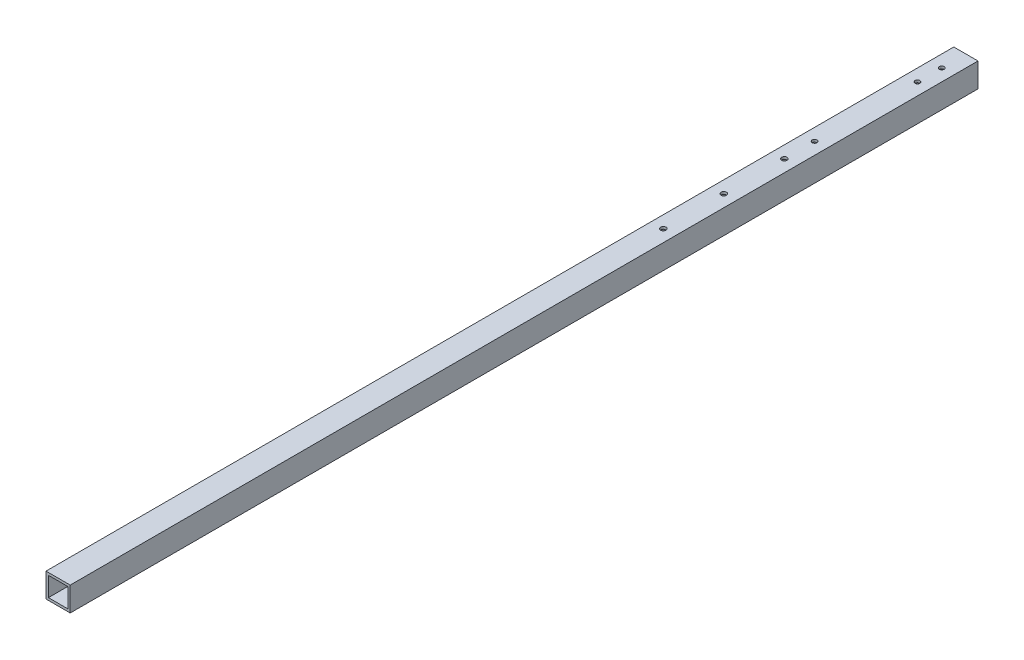
ISO-10303-21;
HEADER;
FILE_DESCRIPTION(('STEP AP214'),'2;1');
FILE_NAME('part.step','',(''),(''),'','','');
FILE_SCHEMA(('AUTOMOTIVE_DESIGN { 1 0 10303 214 1 1 1 1 }'));
ENDSEC;
DATA;
#1=APPLICATION_CONTEXT('core data for automotive mechanical design processes');
#2=APPLICATION_PROTOCOL_DEFINITION('international standard','automotive_design',2000,#1);
#3=PRODUCT_CONTEXT('',#1,'mechanical');
#4=PRODUCT('Part','Part','',(#3));
#5=PRODUCT_RELATED_PRODUCT_CATEGORY('part','',(#4));
#6=PRODUCT_DEFINITION_FORMATION('','',#4);
#7=PRODUCT_DEFINITION_CONTEXT('part definition',#1,'design');
#8=PRODUCT_DEFINITION('design','',#6,#7);
#9=PRODUCT_DEFINITION_SHAPE('','',#8);
#10=(LENGTH_UNIT() NAMED_UNIT(*) SI_UNIT(.MILLI.,.METRE.));
#11=(NAMED_UNIT(*) PLANE_ANGLE_UNIT() SI_UNIT($,.RADIAN.));
#12=(NAMED_UNIT(*) SI_UNIT($,.STERADIAN.) SOLID_ANGLE_UNIT());
#13=UNCERTAINTY_MEASURE_WITH_UNIT(LENGTH_MEASURE(1.E-05),#10,'distance_accuracy_value','');
#14=(GEOMETRIC_REPRESENTATION_CONTEXT(3) GLOBAL_UNCERTAINTY_ASSIGNED_CONTEXT((#13)) GLOBAL_UNIT_ASSIGNED_CONTEXT((#10,
#11,#12)) REPRESENTATION_CONTEXT('',''));
#15=CARTESIAN_POINT('',(0.,0.,0.));
#16=DIRECTION('',(0.,0.,1.));
#17=DIRECTION('',(1.,0.,0.));
#18=AXIS2_PLACEMENT_3D('',#15,#16,#17);
#19=CARTESIAN_POINT('',(0.,0.,375.));
#20=DIRECTION('',(0.,0.,1.));
#21=DIRECTION('',(1.,0.,0.));
#22=AXIS2_PLACEMENT_3D('',#19,#20,#21);
#23=PLANE('',#22);
#24=DIRECTION('',(0.,1.,0.));
#25=VECTOR('',#24,1.);
#26=CARTESIAN_POINT('',(10.,10.,375.));
#27=LINE('',#26,#25);
#28=CARTESIAN_POINT('',(10.,-10.,375.));
#29=VERTEX_POINT('',#28);
#30=CARTESIAN_POINT('',(10.,10.,375.));
#31=VERTEX_POINT('',#30);
#32=EDGE_CURVE('E142',#29,#31,#27,.T.);
#33=ORIENTED_EDGE('',*,*,#32,.T.);
#34=DIRECTION('',(-1.,0.,0.));
#35=VECTOR('',#34,1.);
#36=CARTESIAN_POINT('',(-10.,10.,375.));
#37=LINE('',#36,#35);
#38=CARTESIAN_POINT('',(-10.,10.,375.));
#39=VERTEX_POINT('',#38);
#40=EDGE_CURVE('E145',#31,#39,#37,.T.);
#41=ORIENTED_EDGE('',*,*,#40,.T.);
#42=DIRECTION('',(0.,-1.,0.));
#43=VECTOR('',#42,1.);
#44=CARTESIAN_POINT('',(-10.,10.,375.));
#45=LINE('',#44,#43);
#46=CARTESIAN_POINT('',(-10.,-10.,375.));
#47=VERTEX_POINT('',#46);
#48=EDGE_CURVE('E148',#39,#47,#45,.T.);
#49=ORIENTED_EDGE('',*,*,#48,.T.);
#50=DIRECTION('',(1.,0.,0.));
#51=VECTOR('',#50,1.);
#52=CARTESIAN_POINT('',(-10.,-10.,375.));
#53=LINE('',#52,#51);
#54=EDGE_CURVE('E150',#47,#29,#53,.T.);
#55=ORIENTED_EDGE('',*,*,#54,.T.);
#56=EDGE_LOOP('',(#33,#41,#49,#55));
#57=FACE_BOUND('',#56,.T.);
#58=DIRECTION('',(-1.,0.,0.));
#59=VECTOR('',#58,1.);
#60=CARTESIAN_POINT('',(-8.,8.00000000000001,375.));
#61=LINE('',#60,#59);
#62=CARTESIAN_POINT('',(8.,8.00000000000001,375.));
#63=VERTEX_POINT('',#62);
#64=CARTESIAN_POINT('',(-8.,8.00000000000001,375.));
#65=VERTEX_POINT('',#64);
#66=EDGE_CURVE('E112',#63,#65,#61,.T.);
#67=ORIENTED_EDGE('',*,*,#66,.F.);
#68=DIRECTION('',(0.,1.,0.));
#69=VECTOR('',#68,1.);
#70=CARTESIAN_POINT('',(8.,8.00000000000001,375.));
#71=LINE('',#70,#69);
#72=CARTESIAN_POINT('',(8.,-7.99999999999999,375.));
#73=VERTEX_POINT('',#72);
#74=EDGE_CURVE('E104',#73,#63,#71,.T.);
#75=ORIENTED_EDGE('',*,*,#74,.F.);
#76=DIRECTION('',(1.,0.,0.));
#77=VECTOR('',#76,1.);
#78=CARTESIAN_POINT('',(-8.,-7.99999999999999,375.));
#79=LINE('',#78,#77);
#80=CARTESIAN_POINT('',(-8.,-7.99999999999999,375.));
#81=VERTEX_POINT('',#80);
#82=EDGE_CURVE('E126',#81,#73,#79,.T.);
#83=ORIENTED_EDGE('',*,*,#82,.F.);
#84=DIRECTION('',(0.,-1.,0.));
#85=VECTOR('',#84,1.);
#86=CARTESIAN_POINT('',(-8.,8.00000000000001,375.));
#87=LINE('',#86,#85);
#88=EDGE_CURVE('E124',#65,#81,#87,.T.);
#89=ORIENTED_EDGE('',*,*,#88,.F.);
#90=EDGE_LOOP('',(#67,#75,#83,#89));
#91=FACE_BOUND('',#90,.T.);
#92=ADVANCED_FACE('F37',(#57,#91),#23,.T.);
#93=CARTESIAN_POINT('',(0.,0.,-375.));
#94=DIRECTION('',(0.,0.,1.));
#95=DIRECTION('',(1.,0.,0.));
#96=AXIS2_PLACEMENT_3D('',#93,#94,#95);
#97=PLANE('',#96);
#98=DIRECTION('',(0.,1.,0.));
#99=VECTOR('',#98,1.);
#100=CARTESIAN_POINT('',(10.,10.,-375.));
#101=LINE('',#100,#99);
#102=CARTESIAN_POINT('',(10.,-10.,-375.));
#103=VERTEX_POINT('',#102);
#104=CARTESIAN_POINT('',(10.,10.,-375.));
#105=VERTEX_POINT('',#104);
#106=EDGE_CURVE('E120',#103,#105,#101,.T.);
#107=ORIENTED_EDGE('',*,*,#106,.F.);
#108=DIRECTION('',(1.,0.,0.));
#109=VECTOR('',#108,1.);
#110=CARTESIAN_POINT('',(-10.,-10.,-375.));
#111=LINE('',#110,#109);
#112=CARTESIAN_POINT('',(-10.,-10.,-375.));
#113=VERTEX_POINT('',#112);
#114=EDGE_CURVE('E146',#113,#103,#111,.T.);
#115=ORIENTED_EDGE('',*,*,#114,.F.);
#116=DIRECTION('',(0.,-1.,0.));
#117=VECTOR('',#116,1.);
#118=CARTESIAN_POINT('',(-10.,10.,-375.));
#119=LINE('',#118,#117);
#120=CARTESIAN_POINT('',(-10.,10.,-375.));
#121=VERTEX_POINT('',#120);
#122=EDGE_CURVE('E157',#121,#113,#119,.T.);
#123=ORIENTED_EDGE('',*,*,#122,.F.);
#124=DIRECTION('',(-1.,0.,0.));
#125=VECTOR('',#124,1.);
#126=CARTESIAN_POINT('',(-10.,10.,-375.));
#127=LINE('',#126,#125);
#128=EDGE_CURVE('E155',#105,#121,#127,.T.);
#129=ORIENTED_EDGE('',*,*,#128,.F.);
#130=EDGE_LOOP('',(#107,#115,#123,#129));
#131=FACE_BOUND('',#130,.T.);
#132=DIRECTION('',(0.,1.,0.));
#133=VECTOR('',#132,1.);
#134=CARTESIAN_POINT('',(8.,8.00000000000001,-375.));
#135=LINE('',#134,#133);
#136=CARTESIAN_POINT('',(8.,-7.99999999999999,-375.));
#137=VERTEX_POINT('',#136);
#138=CARTESIAN_POINT('',(8.,8.00000000000001,-375.));
#139=VERTEX_POINT('',#138);
#140=EDGE_CURVE('E62',#137,#139,#135,.T.);
#141=ORIENTED_EDGE('',*,*,#140,.T.);
#142=DIRECTION('',(-1.,0.,0.));
#143=VECTOR('',#142,1.);
#144=CARTESIAN_POINT('',(-8.,8.00000000000001,-375.));
#145=LINE('',#144,#143);
#146=CARTESIAN_POINT('',(-8.,8.00000000000001,-375.));
#147=VERTEX_POINT('',#146);
#148=EDGE_CURVE('E119',#139,#147,#145,.T.);
#149=ORIENTED_EDGE('',*,*,#148,.T.);
#150=DIRECTION('',(0.,-1.,0.));
#151=VECTOR('',#150,1.);
#152=CARTESIAN_POINT('',(-8.,8.00000000000001,-375.));
#153=LINE('',#152,#151);
#154=CARTESIAN_POINT('',(-8.,-7.99999999999999,-375.));
#155=VERTEX_POINT('',#154);
#156=EDGE_CURVE('E134',#147,#155,#153,.T.);
#157=ORIENTED_EDGE('',*,*,#156,.T.);
#158=DIRECTION('',(1.,0.,0.));
#159=VECTOR('',#158,1.);
#160=CARTESIAN_POINT('',(-8.,-7.99999999999999,-375.));
#161=LINE('',#160,#159);
#162=EDGE_CURVE('E113',#155,#137,#161,.T.);
#163=ORIENTED_EDGE('',*,*,#162,.T.);
#164=EDGE_LOOP('',(#141,#149,#157,#163));
#165=FACE_BOUND('',#164,.T.);
#166=ADVANCED_FACE('F259',(#131,#165),#97,.F.);
#167=CARTESIAN_POINT('',(10.,10.,375.));
#168=DIRECTION('',(-1.,0.,0.));
#169=DIRECTION('',(0.,0.,1.));
#170=AXIS2_PLACEMENT_3D('',#167,#168,#169);
#171=PLANE('',#170);
#172=ORIENTED_EDGE('',*,*,#106,.T.);
#173=DIRECTION('',(0.,0.,-1.));
#174=VECTOR('',#173,1.);
#175=CARTESIAN_POINT('',(10.,10.,375.));
#176=LINE('',#175,#174);
#177=EDGE_CURVE('E11',#31,#105,#176,.T.);
#178=ORIENTED_EDGE('',*,*,#177,.F.);
#179=ORIENTED_EDGE('',*,*,#32,.F.);
#180=DIRECTION('',(0.,0.,-1.));
#181=VECTOR('',#180,1.);
#182=CARTESIAN_POINT('',(10.,-10.,375.));
#183=LINE('',#182,#181);
#184=EDGE_CURVE('E152',#29,#103,#183,.T.);
#185=ORIENTED_EDGE('',*,*,#184,.T.);
#186=EDGE_LOOP('',(#172,#178,#179,#185));
#187=FACE_BOUND('',#186,.T.);
#188=ADVANCED_FACE('F39',(#187),#171,.F.);
#189=CARTESIAN_POINT('',(-10.,10.,375.));
#190=DIRECTION('',(0.,-1.,0.));
#191=DIRECTION('',(1.,0.,0.));
#192=AXIS2_PLACEMENT_3D('',#189,#190,#191);
#193=PLANE('',#192);
#194=CARTESIAN_POINT('',(0.,10.,-125.000000000008));
#195=DIRECTION('',(0.,1.,0.));
#196=DIRECTION('',(-1.,0.,0.));
#197=AXIS2_PLACEMENT_3D('',#194,#195,#196);
#198=CIRCLE('',#197,2.25);
#199=CARTESIAN_POINT('',(-2.24999999999999,10.,-125.000000000008));
#200=VERTEX_POINT('',#199);
#201=EDGE_CURVE('E497',#200,#200,#198,.T.);
#202=ORIENTED_EDGE('',*,*,#201,.F.);
#203=EDGE_LOOP('',(#202));
#204=FACE_BOUND('',#203,.T.);
#205=CARTESIAN_POINT('',(0.,10.,-175.000000000008));
#206=DIRECTION('',(0.,1.,0.));
#207=DIRECTION('',(-1.,0.,0.));
#208=AXIS2_PLACEMENT_3D('',#205,#206,#207);
#209=CIRCLE('',#208,2.25);
#210=CARTESIAN_POINT('',(-2.24999999999999,10.,-175.000000000008));
#211=VERTEX_POINT('',#210);
#212=EDGE_CURVE('E498',#211,#211,#209,.T.);
#213=ORIENTED_EDGE('',*,*,#212,.F.);
#214=EDGE_LOOP('',(#213));
#215=FACE_BOUND('',#214,.T.);
#216=CARTESIAN_POINT('',(0.,10.,-225.000000000008));
#217=DIRECTION('',(0.,1.,0.));
#218=DIRECTION('',(-1.,0.,0.));
#219=AXIS2_PLACEMENT_3D('',#216,#217,#218);
#220=CIRCLE('',#219,2.24999999999952);
#221=CARTESIAN_POINT('',(-2.2499999999995,10.,-225.000000000008));
#222=VERTEX_POINT('',#221);
#223=EDGE_CURVE('E507',#222,#222,#220,.T.);
#224=ORIENTED_EDGE('',*,*,#223,.F.);
#225=EDGE_LOOP('',(#224));
#226=FACE_BOUND('',#225,.T.);
#227=CARTESIAN_POINT('',(0.,10.,-355.000000000003));
#228=DIRECTION('',(0.,1.,0.));
#229=DIRECTION('',(-1.,0.,0.));
#230=AXIS2_PLACEMENT_3D('',#227,#228,#229);
#231=CIRCLE('',#230,2.00000000000003);
#232=CARTESIAN_POINT('',(-2.00000000000006,10.,-355.000000000003));
#233=VERTEX_POINT('',#232);
#234=EDGE_CURVE('E171',#233,#233,#231,.T.);
#235=ORIENTED_EDGE('',*,*,#234,.F.);
#236=EDGE_LOOP('',(#235));
#237=FACE_BOUND('',#236,.T.);
#238=CARTESIAN_POINT('',(2.48932818802672E-13,10.,-335.000000000003));
#239=DIRECTION('',(0.,1.,0.));
#240=DIRECTION('',(-1.,0.,0.));
#241=AXIS2_PLACEMENT_3D('',#238,#239,#240);
#242=CIRCLE('',#241,2.);
#243=CARTESIAN_POINT('',(-1.99999999999975,10.,-335.000000000003));
#244=VERTEX_POINT('',#243);
#245=EDGE_CURVE('E207',#244,#244,#242,.T.);
#246=ORIENTED_EDGE('',*,*,#245,.F.);
#247=EDGE_LOOP('',(#246));
#248=FACE_BOUND('',#247,.T.);
#249=CARTESIAN_POINT('',(0.,10.,-250.000000000002));
#250=DIRECTION('',(0.,1.,0.));
#251=DIRECTION('',(-1.,0.,0.));
#252=AXIS2_PLACEMENT_3D('',#249,#250,#251);
#253=CIRCLE('',#252,2.00000000000003);
#254=CARTESIAN_POINT('',(-2.00000000000003,10.,-250.000000000002));
#255=VERTEX_POINT('',#254);
#256=EDGE_CURVE('E213',#255,#255,#253,.T.);
#257=ORIENTED_EDGE('',*,*,#256,.F.);
#258=EDGE_LOOP('',(#257));
#259=FACE_BOUND('',#258,.T.);
#260=ORIENTED_EDGE('',*,*,#128,.T.);
#261=DIRECTION('',(0.,0.,-1.));
#262=VECTOR('',#261,1.);
#263=CARTESIAN_POINT('',(-10.,10.,375.));
#264=LINE('',#263,#262);
#265=EDGE_CURVE('E46',#39,#121,#264,.T.);
#266=ORIENTED_EDGE('',*,*,#265,.F.);
#267=ORIENTED_EDGE('',*,*,#40,.F.);
#268=ORIENTED_EDGE('',*,*,#177,.T.);
#269=EDGE_LOOP('',(#260,#266,#267,#268));
#270=FACE_BOUND('',#269,.T.);
#271=ADVANCED_FACE('F245',(#204,#215,#226,#237,#248,#259,#270),#193,.F.);
#272=CARTESIAN_POINT('',(-10.,10.,375.));
#273=DIRECTION('',(1.,0.,0.));
#274=DIRECTION('',(0.,1.,0.));
#275=AXIS2_PLACEMENT_3D('',#272,#273,#274);
#276=PLANE('',#275);
#277=ORIENTED_EDGE('',*,*,#122,.T.);
#278=DIRECTION('',(0.,0.,-1.));
#279=VECTOR('',#278,1.);
#280=CARTESIAN_POINT('',(-10.,-10.,375.));
#281=LINE('',#280,#279);
#282=EDGE_CURVE('E162',#47,#113,#281,.T.);
#283=ORIENTED_EDGE('',*,*,#282,.F.);
#284=ORIENTED_EDGE('',*,*,#48,.F.);
#285=ORIENTED_EDGE('',*,*,#265,.T.);
#286=EDGE_LOOP('',(#277,#283,#284,#285));
#287=FACE_BOUND('',#286,.T.);
#288=ADVANCED_FACE('F248',(#287),#276,.F.);
#289=CARTESIAN_POINT('',(-10.,-10.,375.));
#290=DIRECTION('',(0.,1.,0.));
#291=DIRECTION('',(-1.,0.,0.));
#292=AXIS2_PLACEMENT_3D('',#289,#290,#291);
#293=PLANE('',#292);
#294=CARTESIAN_POINT('',(0.,-10.,-125.000000000008));
#295=DIRECTION('',(0.,1.,0.));
#296=DIRECTION('',(-1.,0.,0.));
#297=AXIS2_PLACEMENT_3D('',#294,#295,#296);
#298=CIRCLE('',#297,2.25);
#299=CARTESIAN_POINT('',(-2.24999999999999,-10.,-125.000000000008));
#300=VERTEX_POINT('',#299);
#301=EDGE_CURVE('E182',#300,#300,#298,.T.);
#302=ORIENTED_EDGE('',*,*,#301,.T.);
#303=EDGE_LOOP('',(#302));
#304=FACE_BOUND('',#303,.T.);
#305=CARTESIAN_POINT('',(0.,-10.,-175.000000000008));
#306=DIRECTION('',(0.,1.,0.));
#307=DIRECTION('',(-1.,0.,0.));
#308=AXIS2_PLACEMENT_3D('',#305,#306,#307);
#309=CIRCLE('',#308,2.25);
#310=CARTESIAN_POINT('',(-2.24999999999999,-10.,-175.000000000008));
#311=VERTEX_POINT('',#310);
#312=EDGE_CURVE('E503',#311,#311,#309,.T.);
#313=ORIENTED_EDGE('',*,*,#312,.T.);
#314=EDGE_LOOP('',(#313));
#315=FACE_BOUND('',#314,.T.);
#316=CARTESIAN_POINT('',(0.,-10.,-225.000000000008));
#317=DIRECTION('',(0.,1.,0.));
#318=DIRECTION('',(-1.,0.,0.));
#319=AXIS2_PLACEMENT_3D('',#316,#317,#318);
#320=CIRCLE('',#319,2.24999999999952);
#321=CARTESIAN_POINT('',(-2.2499999999995,-10.,-225.000000000008));
#322=VERTEX_POINT('',#321);
#323=EDGE_CURVE('E195',#322,#322,#320,.T.);
#324=ORIENTED_EDGE('',*,*,#323,.T.);
#325=EDGE_LOOP('',(#324));
#326=FACE_BOUND('',#325,.T.);
#327=CARTESIAN_POINT('',(0.,-10.,-355.000000000003));
#328=DIRECTION('',(0.,1.,0.));
#329=DIRECTION('',(-1.,0.,0.));
#330=AXIS2_PLACEMENT_3D('',#327,#328,#329);
#331=CIRCLE('',#330,2.00000000000003);
#332=CARTESIAN_POINT('',(-2.00000000000006,-10.,-355.000000000003));
#333=VERTEX_POINT('',#332);
#334=EDGE_CURVE('E204',#333,#333,#331,.T.);
#335=ORIENTED_EDGE('',*,*,#334,.T.);
#336=EDGE_LOOP('',(#335));
#337=FACE_BOUND('',#336,.T.);
#338=CARTESIAN_POINT('',(2.47198095326695E-13,-10.,-335.000000000003));
#339=DIRECTION('',(0.,1.,0.));
#340=DIRECTION('',(-1.,0.,0.));
#341=AXIS2_PLACEMENT_3D('',#338,#339,#340);
#342=CIRCLE('',#341,2.);
#343=CARTESIAN_POINT('',(-1.99999999999975,-10.,-335.000000000003));
#344=VERTEX_POINT('',#343);
#345=EDGE_CURVE('E210',#344,#344,#342,.T.);
#346=ORIENTED_EDGE('',*,*,#345,.T.);
#347=EDGE_LOOP('',(#346));
#348=FACE_BOUND('',#347,.T.);
#349=CARTESIAN_POINT('',(0.,-10.,-250.000000000002));
#350=DIRECTION('',(0.,1.,0.));
#351=DIRECTION('',(-1.,0.,0.));
#352=AXIS2_PLACEMENT_3D('',#349,#350,#351);
#353=CIRCLE('',#352,2.00000000000003);
#354=CARTESIAN_POINT('',(-2.00000000000004,-10.,-250.000000000002));
#355=VERTEX_POINT('',#354);
#356=EDGE_CURVE('E201',#355,#355,#353,.T.);
#357=ORIENTED_EDGE('',*,*,#356,.T.);
#358=EDGE_LOOP('',(#357));
#359=FACE_BOUND('',#358,.T.);
#360=ORIENTED_EDGE('',*,*,#114,.T.);
#361=ORIENTED_EDGE('',*,*,#184,.F.);
#362=ORIENTED_EDGE('',*,*,#54,.F.);
#363=ORIENTED_EDGE('',*,*,#282,.T.);
#364=EDGE_LOOP('',(#360,#361,#362,#363));
#365=FACE_BOUND('',#364,.T.);
#366=ADVANCED_FACE('F263',(#304,#315,#326,#337,#348,#359,#365),#293,.F.);
#367=CARTESIAN_POINT('',(8.,8.00000000000001,375.));
#368=DIRECTION('',(-1.,0.,0.));
#369=DIRECTION('',(0.,-1.,0.));
#370=AXIS2_PLACEMENT_3D('',#367,#368,#369);
#371=PLANE('',#370);
#372=ORIENTED_EDGE('',*,*,#140,.F.);
#373=DIRECTION('',(0.,0.,-1.));
#374=VECTOR('',#373,1.);
#375=CARTESIAN_POINT('',(8.,-7.99999999999999,375.));
#376=LINE('',#375,#374);
#377=EDGE_CURVE('E108',#73,#137,#376,.T.);
#378=ORIENTED_EDGE('',*,*,#377,.F.);
#379=ORIENTED_EDGE('',*,*,#74,.T.);
#380=DIRECTION('',(0.,0.,-1.));
#381=VECTOR('',#380,1.);
#382=CARTESIAN_POINT('',(8.,8.00000000000001,375.));
#383=LINE('',#382,#381);
#384=EDGE_CURVE('E107',#63,#139,#383,.T.);
#385=ORIENTED_EDGE('',*,*,#384,.T.);
#386=EDGE_LOOP('',(#372,#378,#379,#385));
#387=FACE_BOUND('',#386,.T.);
#388=ADVANCED_FACE('F106',(#387),#371,.T.);
#389=CARTESIAN_POINT('',(-8.,8.00000000000001,375.));
#390=DIRECTION('',(0.,-1.,0.));
#391=DIRECTION('',(1.,0.,0.));
#392=AXIS2_PLACEMENT_3D('',#389,#390,#391);
#393=PLANE('',#392);
#394=CARTESIAN_POINT('',(0.,8.00000000000001,-125.000000000008));
#395=DIRECTION('',(0.,-1.,0.));
#396=DIRECTION('',(1.,0.,0.));
#397=AXIS2_PLACEMENT_3D('',#394,#395,#396);
#398=CIRCLE('',#397,2.25);
#399=CARTESIAN_POINT('',(2.25000000000002,8.00000000000001,-125.000000000008));
#400=VERTEX_POINT('',#399);
#401=EDGE_CURVE('E198',#400,#400,#398,.T.);
#402=ORIENTED_EDGE('',*,*,#401,.F.);
#403=EDGE_LOOP('',(#402));
#404=FACE_BOUND('',#403,.T.);
#405=CARTESIAN_POINT('',(0.,8.00000000000001,-175.000000000008));
#406=DIRECTION('',(0.,-1.,0.));
#407=DIRECTION('',(1.,0.,0.));
#408=AXIS2_PLACEMENT_3D('',#405,#406,#407);
#409=CIRCLE('',#408,2.25);
#410=CARTESIAN_POINT('',(2.25000000000002,8.00000000000001,-175.000000000008));
#411=VERTEX_POINT('',#410);
#412=EDGE_CURVE('E185',#411,#411,#409,.T.);
#413=ORIENTED_EDGE('',*,*,#412,.F.);
#414=EDGE_LOOP('',(#413));
#415=FACE_BOUND('',#414,.T.);
#416=CARTESIAN_POINT('',(0.,8.00000000000001,-225.000000000008));
#417=DIRECTION('',(0.,-1.,0.));
#418=DIRECTION('',(1.,0.,0.));
#419=AXIS2_PLACEMENT_3D('',#416,#417,#418);
#420=CIRCLE('',#419,2.24999999999952);
#421=CARTESIAN_POINT('',(2.24999999999953,8.00000000000001,-225.000000000008));
#422=VERTEX_POINT('',#421);
#423=EDGE_CURVE('E181',#422,#422,#420,.T.);
#424=ORIENTED_EDGE('',*,*,#423,.F.);
#425=EDGE_LOOP('',(#424));
#426=FACE_BOUND('',#425,.T.);
#427=CARTESIAN_POINT('',(0.,8.00000000000001,-355.000000000003));
#428=DIRECTION('',(0.,-1.,0.));
#429=DIRECTION('',(1.,0.,0.));
#430=AXIS2_PLACEMENT_3D('',#427,#428,#429);
#431=CIRCLE('',#430,2.00000000000003);
#432=CARTESIAN_POINT('',(2.00000000000001,8.00000000000001,-355.000000000003));
#433=VERTEX_POINT('',#432);
#434=EDGE_CURVE('E132',#433,#433,#431,.T.);
#435=ORIENTED_EDGE('',*,*,#434,.F.);
#436=EDGE_LOOP('',(#435));
#437=FACE_BOUND('',#436,.T.);
#438=CARTESIAN_POINT('',(2.48759346455074E-13,8.00000000000001,-335.000000000003));
#439=DIRECTION('',(0.,-1.,0.));
#440=DIRECTION('',(1.,0.,0.));
#441=AXIS2_PLACEMENT_3D('',#438,#439,#440);
#442=CIRCLE('',#441,2.);
#443=CARTESIAN_POINT('',(2.00000000000025,8.00000000000001,-335.000000000003));
#444=VERTEX_POINT('',#443);
#445=EDGE_CURVE('E175',#444,#444,#442,.T.);
#446=ORIENTED_EDGE('',*,*,#445,.F.);
#447=EDGE_LOOP('',(#446));
#448=FACE_BOUND('',#447,.T.);
#449=CARTESIAN_POINT('',(0.,8.00000000000001,-250.000000000002));
#450=DIRECTION('',(0.,-1.,0.));
#451=DIRECTION('',(1.,0.,0.));
#452=AXIS2_PLACEMENT_3D('',#449,#450,#451);
#453=CIRCLE('',#452,2.00000000000003);
#454=CARTESIAN_POINT('',(2.00000000000004,8.00000000000001,-250.000000000002));
#455=VERTEX_POINT('',#454);
#456=EDGE_CURVE('E170',#455,#455,#453,.T.);
#457=ORIENTED_EDGE('',*,*,#456,.F.);
#458=EDGE_LOOP('',(#457));
#459=FACE_BOUND('',#458,.T.);
#460=ORIENTED_EDGE('',*,*,#148,.F.);
#461=ORIENTED_EDGE('',*,*,#384,.F.);
#462=ORIENTED_EDGE('',*,*,#66,.T.);
#463=DIRECTION('',(0.,0.,-1.));
#464=VECTOR('',#463,1.);
#465=CARTESIAN_POINT('',(-8.,8.00000000000001,375.));
#466=LINE('',#465,#464);
#467=EDGE_CURVE('E121',#65,#147,#466,.T.);
#468=ORIENTED_EDGE('',*,*,#467,.T.);
#469=EDGE_LOOP('',(#460,#461,#462,#468));
#470=FACE_BOUND('',#469,.T.);
#471=ADVANCED_FACE('F116',(#404,#415,#426,#437,#448,#459,#470),#393,.T.);
#472=CARTESIAN_POINT('',(-8.,8.00000000000001,375.));
#473=DIRECTION('',(1.,0.,0.));
#474=DIRECTION('',(0.,1.,0.));
#475=AXIS2_PLACEMENT_3D('',#472,#473,#474);
#476=PLANE('',#475);
#477=ORIENTED_EDGE('',*,*,#156,.F.);
#478=ORIENTED_EDGE('',*,*,#467,.F.);
#479=ORIENTED_EDGE('',*,*,#88,.T.);
#480=DIRECTION('',(0.,0.,-1.));
#481=VECTOR('',#480,1.);
#482=CARTESIAN_POINT('',(-8.,-7.99999999999999,375.));
#483=LINE('',#482,#481);
#484=EDGE_CURVE('E54',#81,#155,#483,.T.);
#485=ORIENTED_EDGE('',*,*,#484,.T.);
#486=EDGE_LOOP('',(#477,#478,#479,#485));
#487=FACE_BOUND('',#486,.T.);
#488=ADVANCED_FACE('F229',(#487),#476,.T.);
#489=CARTESIAN_POINT('',(-8.,-7.99999999999999,375.));
#490=DIRECTION('',(0.,1.,0.));
#491=DIRECTION('',(0.,0.,1.));
#492=AXIS2_PLACEMENT_3D('',#489,#490,#491);
#493=PLANE('',#492);
#494=CARTESIAN_POINT('',(0.,-7.99999999999999,-125.000000000008));
#495=DIRECTION('',(0.,1.,0.));
#496=DIRECTION('',(0.,0.,1.));
#497=AXIS2_PLACEMENT_3D('',#494,#495,#496);
#498=CIRCLE('',#497,2.25);
#499=CARTESIAN_POINT('',(0.,-7.99999999999999,-122.750000000008));
#500=VERTEX_POINT('',#499);
#501=EDGE_CURVE('E41',#500,#500,#498,.T.);
#502=ORIENTED_EDGE('',*,*,#501,.F.);
#503=EDGE_LOOP('',(#502));
#504=FACE_BOUND('',#503,.T.);
#505=CARTESIAN_POINT('',(0.,-7.99999999999999,-175.000000000008));
#506=DIRECTION('',(0.,1.,0.));
#507=DIRECTION('',(0.,0.,1.));
#508=AXIS2_PLACEMENT_3D('',#505,#506,#507);
#509=CIRCLE('',#508,2.25);
#510=CARTESIAN_POINT('',(0.,-7.99999999999999,-172.750000000008));
#511=VERTEX_POINT('',#510);
#512=EDGE_CURVE('E183',#511,#511,#509,.T.);
#513=ORIENTED_EDGE('',*,*,#512,.F.);
#514=EDGE_LOOP('',(#513));
#515=FACE_BOUND('',#514,.T.);
#516=CARTESIAN_POINT('',(0.,-7.99999999999999,-225.000000000008));
#517=DIRECTION('',(0.,1.,0.));
#518=DIRECTION('',(0.,0.,1.));
#519=AXIS2_PLACEMENT_3D('',#516,#517,#518);
#520=CIRCLE('',#519,2.24999999999952);
#521=CARTESIAN_POINT('',(0.,-7.99999999999999,-222.750000000008));
#522=VERTEX_POINT('',#521);
#523=EDGE_CURVE('E179',#522,#522,#520,.T.);
#524=ORIENTED_EDGE('',*,*,#523,.F.);
#525=EDGE_LOOP('',(#524));
#526=FACE_BOUND('',#525,.T.);
#527=CARTESIAN_POINT('',(0.,-7.99999999999999,-355.000000000003));
#528=DIRECTION('',(0.,1.,0.));
#529=DIRECTION('',(0.,0.,1.));
#530=AXIS2_PLACEMENT_3D('',#527,#528,#529);
#531=CIRCLE('',#530,2.00000000000003);
#532=CARTESIAN_POINT('',(0.,-7.99999999999999,-353.000000000002));
#533=VERTEX_POINT('',#532);
#534=EDGE_CURVE('E176',#533,#533,#531,.T.);
#535=ORIENTED_EDGE('',*,*,#534,.F.);
#536=EDGE_LOOP('',(#535));
#537=FACE_BOUND('',#536,.T.);
#538=CARTESIAN_POINT('',(2.47371567674293E-13,-7.99999999999999,-335.000000000003));
#539=DIRECTION('',(0.,1.,0.));
#540=DIRECTION('',(0.,0.,1.));
#541=AXIS2_PLACEMENT_3D('',#538,#539,#540);
#542=CIRCLE('',#541,2.);
#543=CARTESIAN_POINT('',(2.47371567674293E-13,-7.99999999999999,-333.000000000003));
#544=VERTEX_POINT('',#543);
#545=EDGE_CURVE('E172',#544,#544,#542,.T.);
#546=ORIENTED_EDGE('',*,*,#545,.F.);
#547=EDGE_LOOP('',(#546));
#548=FACE_BOUND('',#547,.T.);
#549=CARTESIAN_POINT('',(0.,-7.99999999999999,-250.000000000002));
#550=DIRECTION('',(0.,1.,0.));
#551=DIRECTION('',(0.,0.,1.));
#552=AXIS2_PLACEMENT_3D('',#549,#550,#551);
#553=CIRCLE('',#552,2.00000000000003);
#554=CARTESIAN_POINT('',(0.,-7.99999999999999,-248.000000000002));
#555=VERTEX_POINT('',#554);
#556=EDGE_CURVE('E167',#555,#555,#553,.T.);
#557=ORIENTED_EDGE('',*,*,#556,.F.);
#558=EDGE_LOOP('',(#557));
#559=FACE_BOUND('',#558,.T.);
#560=ORIENTED_EDGE('',*,*,#162,.F.);
#561=ORIENTED_EDGE('',*,*,#484,.F.);
#562=ORIENTED_EDGE('',*,*,#82,.T.);
#563=ORIENTED_EDGE('',*,*,#377,.T.);
#564=EDGE_LOOP('',(#560,#561,#562,#563));
#565=FACE_BOUND('',#564,.T.);
#566=ADVANCED_FACE('F314',(#504,#515,#526,#537,#548,#559,#565),#493,.T.);
#567=CARTESIAN_POINT('',(0.,-10.,-250.000000000002));
#568=DIRECTION('',(0.,1.,0.));
#569=DIRECTION('',(-1.,0.,0.));
#570=AXIS2_PLACEMENT_3D('',#567,#568,#569);
#571=CYLINDRICAL_SURFACE('',#570,2.00000000000003);
#572=ORIENTED_EDGE('',*,*,#556,.T.);
#573=EDGE_LOOP('',(#572));
#574=FACE_BOUND('',#573,.T.);
#575=ORIENTED_EDGE('',*,*,#356,.F.);
#576=EDGE_LOOP('',(#575));
#577=FACE_BOUND('',#576,.T.);
#578=ADVANCED_FACE('F242',(#574,#577),#571,.F.);
#579=CARTESIAN_POINT('',(2.47198095326695E-13,-10.,-335.000000000003));
#580=DIRECTION('',(0.,1.,0.));
#581=DIRECTION('',(-1.,0.,0.));
#582=AXIS2_PLACEMENT_3D('',#579,#580,#581);
#583=CYLINDRICAL_SURFACE('',#582,2.);
#584=ORIENTED_EDGE('',*,*,#545,.T.);
#585=EDGE_LOOP('',(#584));
#586=FACE_BOUND('',#585,.T.);
#587=ORIENTED_EDGE('',*,*,#345,.F.);
#588=EDGE_LOOP('',(#587));
#589=FACE_BOUND('',#588,.T.);
#590=ADVANCED_FACE('F332',(#586,#589),#583,.F.);
#591=CARTESIAN_POINT('',(0.,-10.,-355.000000000003));
#592=DIRECTION('',(0.,1.,0.));
#593=DIRECTION('',(-1.,0.,0.));
#594=AXIS2_PLACEMENT_3D('',#591,#592,#593);
#595=CYLINDRICAL_SURFACE('',#594,2.00000000000003);
#596=ORIENTED_EDGE('',*,*,#534,.T.);
#597=EDGE_LOOP('',(#596));
#598=FACE_BOUND('',#597,.T.);
#599=ORIENTED_EDGE('',*,*,#334,.F.);
#600=EDGE_LOOP('',(#599));
#601=FACE_BOUND('',#600,.T.);
#602=ADVANCED_FACE('F240',(#598,#601),#595,.F.);
#603=ORIENTED_EDGE('',*,*,#456,.T.);
#604=EDGE_LOOP('',(#603));
#605=FACE_BOUND('',#604,.T.);
#606=ORIENTED_EDGE('',*,*,#256,.T.);
#607=EDGE_LOOP('',(#606));
#608=FACE_BOUND('',#607,.T.);
#609=ADVANCED_FACE('F236',(#605,#608),#571,.F.);
#610=ORIENTED_EDGE('',*,*,#445,.T.);
#611=EDGE_LOOP('',(#610));
#612=FACE_BOUND('',#611,.T.);
#613=ORIENTED_EDGE('',*,*,#245,.T.);
#614=EDGE_LOOP('',(#613));
#615=FACE_BOUND('',#614,.T.);
#616=ADVANCED_FACE('F239',(#612,#615),#583,.F.);
#617=ORIENTED_EDGE('',*,*,#434,.T.);
#618=EDGE_LOOP('',(#617));
#619=FACE_BOUND('',#618,.T.);
#620=ORIENTED_EDGE('',*,*,#234,.T.);
#621=EDGE_LOOP('',(#620));
#622=FACE_BOUND('',#621,.T.);
#623=ADVANCED_FACE('F224',(#619,#622),#595,.F.);
#624=CARTESIAN_POINT('',(0.,-10.,-225.000000000008));
#625=DIRECTION('',(0.,1.,0.));
#626=DIRECTION('',(-1.,0.,0.));
#627=AXIS2_PLACEMENT_3D('',#624,#625,#626);
#628=CYLINDRICAL_SURFACE('',#627,2.24999999999952);
#629=ORIENTED_EDGE('',*,*,#523,.T.);
#630=EDGE_LOOP('',(#629));
#631=FACE_BOUND('',#630,.T.);
#632=ORIENTED_EDGE('',*,*,#323,.F.);
#633=EDGE_LOOP('',(#632));
#634=FACE_BOUND('',#633,.T.);
#635=ADVANCED_FACE('F362',(#631,#634),#628,.F.);
#636=CARTESIAN_POINT('',(0.,-10.,-175.000000000008));
#637=DIRECTION('',(0.,1.,0.));
#638=DIRECTION('',(-1.,0.,0.));
#639=AXIS2_PLACEMENT_3D('',#636,#637,#638);
#640=CYLINDRICAL_SURFACE('',#639,2.25);
#641=ORIENTED_EDGE('',*,*,#512,.T.);
#642=EDGE_LOOP('',(#641));
#643=FACE_BOUND('',#642,.T.);
#644=ORIENTED_EDGE('',*,*,#312,.F.);
#645=EDGE_LOOP('',(#644));
#646=FACE_BOUND('',#645,.T.);
#647=ADVANCED_FACE('F367',(#643,#646),#640,.F.);
#648=CARTESIAN_POINT('',(0.,-10.,-125.000000000008));
#649=DIRECTION('',(0.,1.,0.));
#650=DIRECTION('',(-1.,0.,0.));
#651=AXIS2_PLACEMENT_3D('',#648,#649,#650);
#652=CYLINDRICAL_SURFACE('',#651,2.25);
#653=ORIENTED_EDGE('',*,*,#501,.T.);
#654=EDGE_LOOP('',(#653));
#655=FACE_BOUND('',#654,.T.);
#656=ORIENTED_EDGE('',*,*,#301,.F.);
#657=EDGE_LOOP('',(#656));
#658=FACE_BOUND('',#657,.T.);
#659=ADVANCED_FACE('F376',(#655,#658),#652,.F.);
#660=ORIENTED_EDGE('',*,*,#423,.T.);
#661=EDGE_LOOP('',(#660));
#662=FACE_BOUND('',#661,.T.);
#663=ORIENTED_EDGE('',*,*,#223,.T.);
#664=EDGE_LOOP('',(#663));
#665=FACE_BOUND('',#664,.T.);
#666=ADVANCED_FACE('F370',(#662,#665),#628,.F.);
#667=ORIENTED_EDGE('',*,*,#412,.T.);
#668=EDGE_LOOP('',(#667));
#669=FACE_BOUND('',#668,.T.);
#670=ORIENTED_EDGE('',*,*,#212,.T.);
#671=EDGE_LOOP('',(#670));
#672=FACE_BOUND('',#671,.T.);
#673=ADVANCED_FACE('F378',(#669,#672),#640,.F.);
#674=ORIENTED_EDGE('',*,*,#401,.T.);
#675=EDGE_LOOP('',(#674));
#676=FACE_BOUND('',#675,.T.);
#677=ORIENTED_EDGE('',*,*,#201,.T.);
#678=EDGE_LOOP('',(#677));
#679=FACE_BOUND('',#678,.T.);
#680=ADVANCED_FACE('F386',(#676,#679),#652,.F.);
#681=CLOSED_SHELL('',(#92,#166,#188,#271,#288,#366,#388,#471,#488,#566,#578,#590,#602,#609,#616,
#623,#635,#647,#659,#666,#673,#680));
#682=MANIFOLD_SOLID_BREP('B2',#681);
#683=ADVANCED_BREP_SHAPE_REPRESENTATION('',(#18,#682),#14);
#684=SHAPE_DEFINITION_REPRESENTATION(#9,#683);
ENDSEC;
END-ISO-10303-21;
